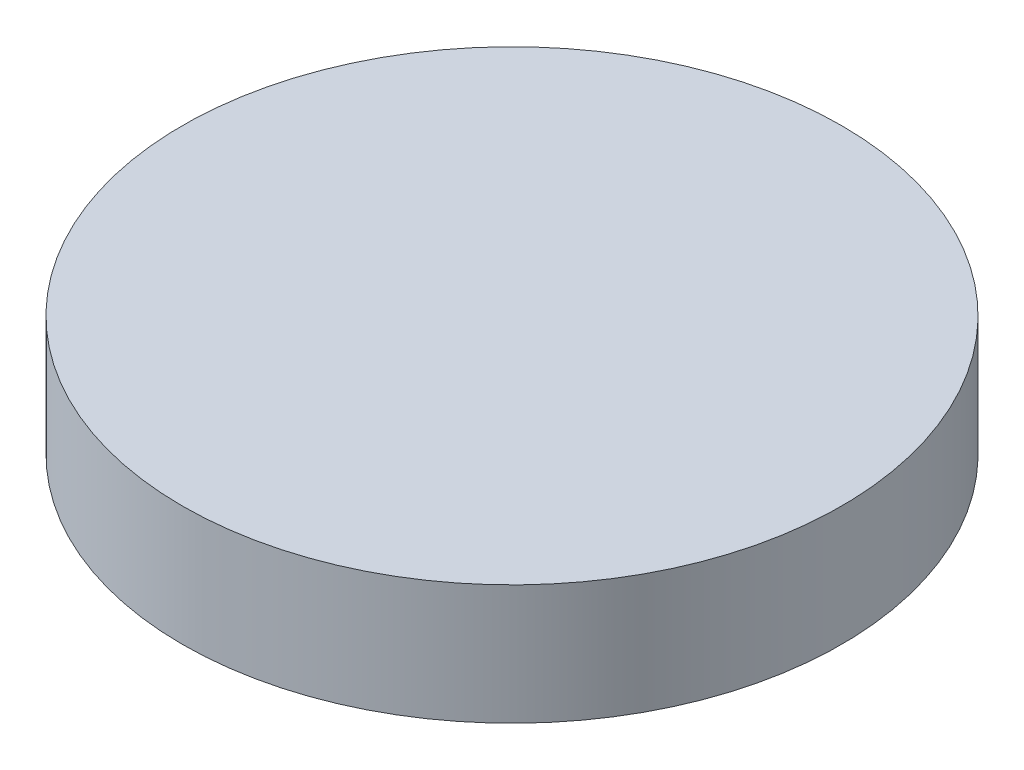
ISO-10303-21;
HEADER;
FILE_DESCRIPTION(('STEP AP214'),'2;1');
FILE_NAME('part.step','',(''),(''),'','','');
FILE_SCHEMA(('AUTOMOTIVE_DESIGN { 1 0 10303 214 1 1 1 1 }'));
ENDSEC;
DATA;
#1=APPLICATION_CONTEXT('core data for automotive mechanical design processes');
#2=APPLICATION_PROTOCOL_DEFINITION('international standard','automotive_design',2000,#1);
#3=PRODUCT_CONTEXT('',#1,'mechanical');
#4=PRODUCT('Part','Part','',(#3));
#5=PRODUCT_RELATED_PRODUCT_CATEGORY('part','',(#4));
#6=PRODUCT_DEFINITION_FORMATION('','',#4);
#7=PRODUCT_DEFINITION_CONTEXT('part definition',#1,'design');
#8=PRODUCT_DEFINITION('design','',#6,#7);
#9=PRODUCT_DEFINITION_SHAPE('','',#8);
#10=(LENGTH_UNIT() NAMED_UNIT(*) SI_UNIT(.MILLI.,.METRE.));
#11=(NAMED_UNIT(*) PLANE_ANGLE_UNIT() SI_UNIT($,.RADIAN.));
#12=(NAMED_UNIT(*) SI_UNIT($,.STERADIAN.) SOLID_ANGLE_UNIT());
#13=UNCERTAINTY_MEASURE_WITH_UNIT(LENGTH_MEASURE(1.E-05),#10,'distance_accuracy_value','');
#14=(GEOMETRIC_REPRESENTATION_CONTEXT(3) GLOBAL_UNCERTAINTY_ASSIGNED_CONTEXT((#13)) GLOBAL_UNIT_ASSIGNED_CONTEXT((#10,
#11,#12)) REPRESENTATION_CONTEXT('',''));
#15=CARTESIAN_POINT('',(0.,0.,0.));
#16=DIRECTION('',(0.,0.,1.));
#17=DIRECTION('',(1.,0.,0.));
#18=AXIS2_PLACEMENT_3D('',#15,#16,#17);
#19=CARTESIAN_POINT('',(0.,12.7,0.));
#20=DIRECTION('',(0.,-1.,0.));
#21=DIRECTION('',(0.,0.,-1.));
#22=AXIS2_PLACEMENT_3D('',#19,#20,#21);
#23=CYLINDRICAL_SURFACE('',#22,34.925);
#24=CARTESIAN_POINT('',(0.,12.7,0.));
#25=DIRECTION('',(0.,1.,0.));
#26=DIRECTION('',(0.,0.,1.));
#27=AXIS2_PLACEMENT_3D('',#24,#25,#26);
#28=CIRCLE('',#27,34.925);
#29=CARTESIAN_POINT('',(0.,12.7,34.925));
#30=VERTEX_POINT('',#29);
#31=EDGE_CURVE('E10',#30,#30,#28,.T.);
#32=ORIENTED_EDGE('',*,*,#31,.F.);
#33=EDGE_LOOP('',(#32));
#34=FACE_BOUND('',#33,.T.);
#35=CARTESIAN_POINT('',(0.,0.,0.));
#36=DIRECTION('',(0.,1.,0.));
#37=DIRECTION('',(0.,0.,1.));
#38=AXIS2_PLACEMENT_3D('',#35,#36,#37);
#39=CIRCLE('',#38,34.925);
#40=CARTESIAN_POINT('',(0.,0.,34.925));
#41=VERTEX_POINT('',#40);
#42=EDGE_CURVE('E42',#41,#41,#39,.T.);
#43=ORIENTED_EDGE('',*,*,#42,.T.);
#44=EDGE_LOOP('',(#43));
#45=FACE_BOUND('',#44,.T.);
#46=ADVANCED_FACE('F39',(#34,#45),#23,.T.);
#47=CARTESIAN_POINT('',(0.,12.7,0.));
#48=DIRECTION('',(0.,1.,0.));
#49=DIRECTION('',(0.,0.,1.));
#50=AXIS2_PLACEMENT_3D('',#47,#48,#49);
#51=PLANE('',#50);
#52=ORIENTED_EDGE('',*,*,#31,.T.);
#53=EDGE_LOOP('',(#52));
#54=FACE_BOUND('',#53,.T.);
#55=ADVANCED_FACE('F73',(#54),#51,.T.);
#56=CARTESIAN_POINT('',(0.,0.,0.));
#57=DIRECTION('',(0.,1.,0.));
#58=DIRECTION('',(0.,0.,1.));
#59=AXIS2_PLACEMENT_3D('',#56,#57,#58);
#60=PLANE('',#59);
#61=CARTESIAN_POINT('',(0.,0.,0.));
#62=DIRECTION('',(0.,1.,0.));
#63=DIRECTION('',(0.,0.,1.));
#64=AXIS2_PLACEMENT_3D('',#61,#62,#63);
#65=CIRCLE('',#64,16.764);
#66=CARTESIAN_POINT('',(0.,0.,-16.764));
#67=VERTEX_POINT('',#66);
#68=EDGE_CURVE('E53',#67,#67,#65,.T.);
#69=ORIENTED_EDGE('',*,*,#68,.T.);
#70=EDGE_LOOP('',(#69));
#71=FACE_BOUND('',#70,.T.);
#72=ORIENTED_EDGE('',*,*,#42,.F.);
#73=EDGE_LOOP('',(#72));
#74=FACE_BOUND('',#73,.T.);
#75=ADVANCED_FACE('F70',(#71,#74),#60,.F.);
#76=CARTESIAN_POINT('',(0.,6.096,0.));
#77=DIRECTION('',(0.,-1.,0.));
#78=DIRECTION('',(0.,0.,-1.));
#79=AXIS2_PLACEMENT_3D('',#76,#77,#78);
#80=CYLINDRICAL_SURFACE('',#79,16.764);
#81=CARTESIAN_POINT('',(0.,6.096,0.));
#82=DIRECTION('',(0.,1.,0.));
#83=DIRECTION('',(0.,0.,1.));
#84=AXIS2_PLACEMENT_3D('',#81,#82,#83);
#85=CIRCLE('',#84,16.764);
#86=CARTESIAN_POINT('',(0.,6.096,-16.764));
#87=VERTEX_POINT('',#86);
#88=EDGE_CURVE('E51',#87,#87,#85,.T.);
#89=CARTESIAN_POINT('',(0.,6.096,-16.764));
#90=CARTESIAN_POINT('',(0.,6.0325,-16.764));
#91=CARTESIAN_POINT('',(0.,5.969,-16.764));
#92=CARTESIAN_POINT('',(0.,5.842,-16.764));
#93=CARTESIAN_POINT('',(0.,5.7785,-16.764));
#94=CARTESIAN_POINT('',(0.,5.6515,-16.764));
#95=CARTESIAN_POINT('',(0.,5.588,-16.764));
#96=CARTESIAN_POINT('',(0.,5.461,-16.764));
#97=CARTESIAN_POINT('',(0.,5.3975,-16.764));
#98=CARTESIAN_POINT('',(0.,5.2705,-16.764));
#99=CARTESIAN_POINT('',(0.,5.207,-16.764));
#100=CARTESIAN_POINT('',(0.,5.08,-16.764));
#101=CARTESIAN_POINT('',(0.,5.0165,-16.764));
#102=CARTESIAN_POINT('',(0.,4.8895,-16.764));
#103=CARTESIAN_POINT('',(0.,4.826,-16.764));
#104=CARTESIAN_POINT('',(0.,4.699,-16.764));
#105=CARTESIAN_POINT('',(0.,4.6355,-16.764));
#106=CARTESIAN_POINT('',(0.,4.5085,-16.764));
#107=CARTESIAN_POINT('',(0.,4.445,-16.764));
#108=CARTESIAN_POINT('',(0.,4.318,-16.764));
#109=CARTESIAN_POINT('',(0.,4.2545,-16.764));
#110=CARTESIAN_POINT('',(0.,4.1275,-16.764));
#111=CARTESIAN_POINT('',(0.,4.064,-16.764));
#112=CARTESIAN_POINT('',(0.,3.937,-16.764));
#113=CARTESIAN_POINT('',(0.,3.8735,-16.764));
#114=CARTESIAN_POINT('',(0.,3.7465,-16.764));
#115=CARTESIAN_POINT('',(0.,3.683,-16.764));
#116=CARTESIAN_POINT('',(0.,3.556,-16.764));
#117=CARTESIAN_POINT('',(0.,3.4925,-16.764));
#118=CARTESIAN_POINT('',(0.,3.3655,-16.764));
#119=CARTESIAN_POINT('',(0.,3.302,-16.764));
#120=CARTESIAN_POINT('',(0.,3.175,-16.764));
#121=CARTESIAN_POINT('',(0.,3.1115,-16.764));
#122=CARTESIAN_POINT('',(0.,2.9845,-16.764));
#123=CARTESIAN_POINT('',(0.,2.921,-16.764));
#124=CARTESIAN_POINT('',(0.,2.794,-16.764));
#125=CARTESIAN_POINT('',(0.,2.7305,-16.764));
#126=CARTESIAN_POINT('',(0.,2.6035,-16.764));
#127=CARTESIAN_POINT('',(0.,2.54,-16.764));
#128=CARTESIAN_POINT('',(0.,2.413,-16.764));
#129=CARTESIAN_POINT('',(0.,2.3495,-16.764));
#130=CARTESIAN_POINT('',(0.,2.2225,-16.764));
#131=CARTESIAN_POINT('',(0.,2.159,-16.764));
#132=CARTESIAN_POINT('',(0.,2.032,-16.764));
#133=CARTESIAN_POINT('',(0.,1.9685,-16.764));
#134=CARTESIAN_POINT('',(0.,1.8415,-16.764));
#135=CARTESIAN_POINT('',(0.,1.778,-16.764));
#136=CARTESIAN_POINT('',(0.,1.651,-16.764));
#137=CARTESIAN_POINT('',(0.,1.5875,-16.764));
#138=CARTESIAN_POINT('',(0.,1.4605,-16.764));
#139=CARTESIAN_POINT('',(0.,1.397,-16.764));
#140=CARTESIAN_POINT('',(0.,1.27,-16.764));
#141=CARTESIAN_POINT('',(0.,1.2065,-16.764));
#142=CARTESIAN_POINT('',(0.,1.0795,-16.764));
#143=CARTESIAN_POINT('',(0.,1.016,-16.764));
#144=CARTESIAN_POINT('',(0.,0.889,-16.764));
#145=CARTESIAN_POINT('',(0.,0.8255,-16.764));
#146=CARTESIAN_POINT('',(0.,0.6985,-16.764));
#147=CARTESIAN_POINT('',(0.,0.635,-16.764));
#148=CARTESIAN_POINT('',(0.,0.508,-16.764));
#149=CARTESIAN_POINT('',(0.,0.4445,-16.764));
#150=CARTESIAN_POINT('',(0.,0.3175,-16.764));
#151=CARTESIAN_POINT('',(0.,0.254,-16.764));
#152=CARTESIAN_POINT('',(0.,0.127,-16.764));
#153=CARTESIAN_POINT('',(0.,0.0634999999999999,-16.764));
#154=CARTESIAN_POINT('',(0.,0.,-16.764));
#155=B_SPLINE_CURVE_WITH_KNOTS('',3,(#89,#90,#91,#92,#93,#94,#95,#96,#97,#98,#99,#100,#101,#102,
#103,#104,#105,#106,#107,#108,#109,#110,#111,#112,#113,#114,#115,#116,#117,#118,#119,#120,#121,
#122,#123,#124,#125,#126,#127,#128,#129,#130,#131,#132,#133,#134,#135,#136,#137,#138,#139,#140,
#141,#142,#143,#144,#145,#146,#147,#148,#149,#150,#151,#152,#153,#154),.UNSPECIFIED.,.F.,.F.,(4,
2,2,2,2,2,2,2,2,2,2,2,2,2,2,2,2,2,2,2,2,2,2,2,2,2,2,2,2,2,2,2,4),(0.,0.1905,0.380999999999999,
0.571499999999999,0.762,0.952499999999999,1.143,1.3335,1.524,1.7145,1.905,2.0955,2.286,2.4765,
2.667,2.8575,3.048,3.2385,3.429,3.6195,3.81,4.0005,4.191,4.3815,4.572,4.7625,4.953,5.1435,5.334,
5.5245,5.715,5.9055,6.096),.UNSPECIFIED.);
#156=EDGE_CURVE('BSEAM61',#87,#67,#155,.T.);
#157=ORIENTED_EDGE('',*,*,#88,.T.);
#158=ORIENTED_EDGE('',*,*,#68,.F.);
#159=ORIENTED_EDGE('',*,*,#156,.T.);
#160=ORIENTED_EDGE('',*,*,#156,.F.);
#161=EDGE_LOOP('',(#157,#159,#158,#160));
#162=FACE_BOUND('',#161,.T.);
#163=ADVANCED_FACE('F61',(#162),#80,.F.);
#164=CARTESIAN_POINT('',(0.,6.096,0.));
#165=DIRECTION('',(0.,1.,0.));
#166=DIRECTION('',(0.,0.,1.));
#167=AXIS2_PLACEMENT_3D('',#164,#165,#166);
#168=PLANE('',#167);
#169=ORIENTED_EDGE('',*,*,#88,.F.);
#170=EDGE_LOOP('',(#169));
#171=FACE_BOUND('',#170,.T.);
#172=ADVANCED_FACE('F64',(#171),#168,.F.);
#173=CLOSED_SHELL('',(#46,#55,#75,#163,#172));
#174=MANIFOLD_SOLID_BREP('B2',#173);
#175=ADVANCED_BREP_SHAPE_REPRESENTATION('',(#18,#174),#14);
#176=SHAPE_DEFINITION_REPRESENTATION(#9,#175);
ENDSEC;
END-ISO-10303-21;
